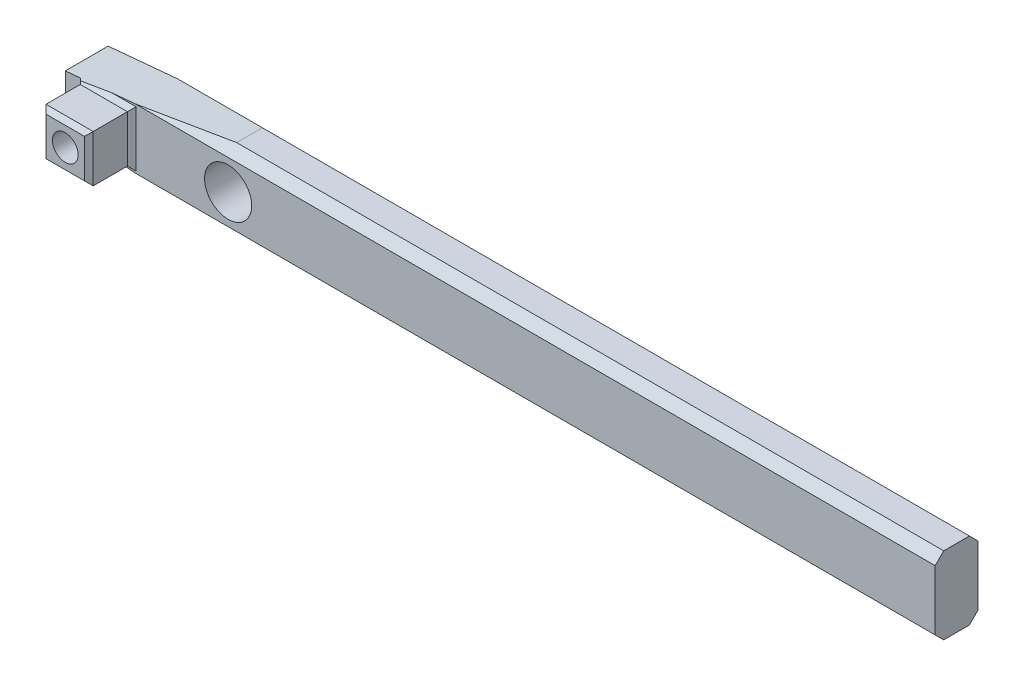
ISO-10303-21;
HEADER;
FILE_DESCRIPTION(('STEP AP214'),'2;1');
FILE_NAME('part.step','',(''),(''),'','','');
FILE_SCHEMA(('AUTOMOTIVE_DESIGN { 1 0 10303 214 1 1 1 1 }'));
ENDSEC;
DATA;
#1=APPLICATION_CONTEXT('core data for automotive mechanical design processes');
#2=APPLICATION_PROTOCOL_DEFINITION('international standard','automotive_design',2000,#1);
#3=PRODUCT_CONTEXT('',#1,'mechanical');
#4=PRODUCT('Part','Part','',(#3));
#5=PRODUCT_RELATED_PRODUCT_CATEGORY('part','',(#4));
#6=PRODUCT_DEFINITION_FORMATION('','',#4);
#7=PRODUCT_DEFINITION_CONTEXT('part definition',#1,'design');
#8=PRODUCT_DEFINITION('design','',#6,#7);
#9=PRODUCT_DEFINITION_SHAPE('','',#8);
#10=(LENGTH_UNIT() NAMED_UNIT(*) SI_UNIT(.MILLI.,.METRE.));
#11=(NAMED_UNIT(*) PLANE_ANGLE_UNIT() SI_UNIT($,.RADIAN.));
#12=(NAMED_UNIT(*) SI_UNIT($,.STERADIAN.) SOLID_ANGLE_UNIT());
#13=UNCERTAINTY_MEASURE_WITH_UNIT(LENGTH_MEASURE(1.E-05),#10,'distance_accuracy_value','');
#14=(GEOMETRIC_REPRESENTATION_CONTEXT(3) GLOBAL_UNCERTAINTY_ASSIGNED_CONTEXT((#13)) GLOBAL_UNIT_ASSIGNED_CONTEXT((#10,
#11,#12)) REPRESENTATION_CONTEXT('',''));
#15=CARTESIAN_POINT('',(0.,0.,0.));
#16=DIRECTION('',(0.,0.,1.));
#17=DIRECTION('',(1.,0.,0.));
#18=AXIS2_PLACEMENT_3D('',#15,#16,#17);
#19=CARTESIAN_POINT('',(0.,0.,5.));
#20=DIRECTION('',(0.,0.,-1.));
#21=DIRECTION('',(-1.,0.,0.));
#22=AXIS2_PLACEMENT_3D('',#19,#20,#21);
#23=PLANE('',#22);
#24=CARTESIAN_POINT('',(0.,0.,5.));
#25=DIRECTION('',(0.,0.,1.));
#26=DIRECTION('',(1.,0.,0.));
#27=AXIS2_PLACEMENT_3D('',#24,#25,#26);
#28=CIRCLE('',#27,2.75);
#29=CARTESIAN_POINT('',(2.75,0.,5.));
#30=VERTEX_POINT('',#29);
#31=EDGE_CURVE('E226',#30,#30,#28,.T.);
#32=ORIENTED_EDGE('',*,*,#31,.F.);
#33=EDGE_LOOP('',(#32));
#34=FACE_BOUND('',#33,.T.);
#35=DIRECTION('',(-0.995785108762236,-0.0917170494912561,0.));
#36=VECTOR('',#35,1.);
#37=CARTESIAN_POINT('',(-19.,2.75,5.));
#38=LINE('',#37,#36);
#39=CARTESIAN_POINT('',(-10.8571428571432,3.49999999999994,5.));
#40=VERTEX_POINT('',#39);
#41=CARTESIAN_POINT('',(-13.5714285714284,3.25000000000001,5.));
#42=VERTEX_POINT('',#41);
#43=EDGE_CURVE('E198',#40,#42,#38,.T.);
#44=ORIENTED_EDGE('',*,*,#43,.T.);
#45=DIRECTION('',(1.,0.,0.));
#46=VECTOR('',#45,1.);
#47=CARTESIAN_POINT('',(0.,3.25000000000001,5.));
#48=LINE('',#47,#46);
#49=CARTESIAN_POINT('',(-10.75,3.25000000000001,5.));
#50=VERTEX_POINT('',#49);
#51=EDGE_CURVE('E285',#42,#50,#48,.T.);
#52=ORIENTED_EDGE('',*,*,#51,.T.);
#53=DIRECTION('',(0.,-1.,0.));
#54=VECTOR('',#53,1.);
#55=CARTESIAN_POINT('',(-10.75,-2.75,5.));
#56=LINE('',#55,#54);
#57=CARTESIAN_POINT('',(-10.75,-3.25000000000002,5.));
#58=VERTEX_POINT('',#57);
#59=EDGE_CURVE('E283',#50,#58,#56,.T.);
#60=ORIENTED_EDGE('',*,*,#59,.T.);
#61=DIRECTION('',(-1.,0.,0.));
#62=VECTOR('',#61,1.);
#63=CARTESIAN_POINT('',(-16.75,-3.25000000000002,5.));
#64=LINE('',#63,#62);
#65=CARTESIAN_POINT('',(-13.5714285714284,-3.25000000000002,5.));
#66=VERTEX_POINT('',#65);
#67=EDGE_CURVE('E281',#58,#66,#64,.T.);
#68=ORIENTED_EDGE('',*,*,#67,.T.);
#69=DIRECTION('',(0.995785108762236,-0.0917170494912585,0.));
#70=VECTOR('',#69,1.);
#71=CARTESIAN_POINT('',(-19.,-2.75,5.));
#72=LINE('',#71,#70);
#73=CARTESIAN_POINT('',(-10.857142857143,-3.49999999999998,5.));
#74=VERTEX_POINT('',#73);
#75=EDGE_CURVE('E215',#66,#74,#72,.T.);
#76=ORIENTED_EDGE('',*,*,#75,.T.);
#77=DIRECTION('',(1.,0.,0.));
#78=VECTOR('',#77,1.);
#79=CARTESIAN_POINT('',(0.,-3.49999999999998,5.));
#80=LINE('',#79,#78);
#81=CARTESIAN_POINT('',(82.5,-3.49999999999998,5.));
#82=VERTEX_POINT('',#81);
#83=EDGE_CURVE('E246',#74,#82,#80,.T.);
#84=ORIENTED_EDGE('',*,*,#83,.T.);
#85=DIRECTION('',(0.,1.,0.));
#86=VECTOR('',#85,1.);
#87=CARTESIAN_POINT('',(82.5,4.5,5.));
#88=LINE('',#87,#86);
#89=CARTESIAN_POINT('',(82.5,3.5,5.));
#90=VERTEX_POINT('',#89);
#91=EDGE_CURVE('E199',#82,#90,#88,.T.);
#92=ORIENTED_EDGE('',*,*,#91,.T.);
#93=DIRECTION('',(-1.,0.,0.));
#94=VECTOR('',#93,1.);
#95=CARTESIAN_POINT('',(0.,3.49999999999995,5.));
#96=LINE('',#95,#94);
#97=EDGE_CURVE('E243',#90,#40,#96,.T.);
#98=ORIENTED_EDGE('',*,*,#97,.T.);
#99=EDGE_LOOP('',(#44,#52,#60,#68,#76,#84,#92,#98));
#100=FACE_BOUND('',#99,.T.);
#101=ADVANCED_FACE('F51',(#34,#100),#23,.F.);
#102=CARTESIAN_POINT('',(-19.,-2.75,5.));
#103=VERTEX_POINT('',#102);
#104=CARTESIAN_POINT('',(-17.25,-2.91118421052632,5.));
#105=VERTEX_POINT('',#104);
#106=EDGE_CURVE('E217',#103,#105,#72,.T.);
#107=ORIENTED_EDGE('',*,*,#106,.T.);
#108=DIRECTION('',(0.,1.,0.));
#109=VECTOR('',#108,1.);
#110=CARTESIAN_POINT('',(-17.25,0.,5.));
#111=LINE('',#110,#109);
#112=CARTESIAN_POINT('',(-17.25,2.91118421052631,5.));
#113=VERTEX_POINT('',#112);
#114=EDGE_CURVE('E197',#105,#113,#111,.T.);
#115=ORIENTED_EDGE('',*,*,#114,.T.);
#116=CARTESIAN_POINT('',(-19.,2.75,5.));
#117=VERTEX_POINT('',#116);
#118=EDGE_CURVE('E189',#113,#117,#38,.T.);
#119=ORIENTED_EDGE('',*,*,#118,.T.);
#120=DIRECTION('',(0.,-1.,0.));
#121=VECTOR('',#120,1.);
#122=CARTESIAN_POINT('',(-19.,2.75,5.));
#123=LINE('',#122,#121);
#124=EDGE_CURVE('E194',#117,#103,#123,.T.);
#125=ORIENTED_EDGE('',*,*,#124,.T.);
#126=EDGE_LOOP('',(#107,#115,#119,#125));
#127=FACE_BOUND('',#126,.T.);
#128=ADVANCED_FACE('F192',(#127),#23,.F.);
#129=CARTESIAN_POINT('',(0.,0.,0.));
#130=DIRECTION('',(0.,0.,-1.));
#131=DIRECTION('',(-1.,0.,0.));
#132=AXIS2_PLACEMENT_3D('',#129,#130,#131);
#133=PLANE('',#132);
#134=CARTESIAN_POINT('',(-14.,0.,0.));
#135=DIRECTION('',(0.,0.,1.));
#136=DIRECTION('',(1.,0.,0.));
#137=AXIS2_PLACEMENT_3D('',#134,#135,#136);
#138=CIRCLE('',#137,1.5);
#139=CARTESIAN_POINT('',(-12.5,0.,0.));
#140=VERTEX_POINT('',#139);
#141=EDGE_CURVE('E365',#140,#140,#138,.T.);
#142=ORIENTED_EDGE('',*,*,#141,.T.);
#143=EDGE_LOOP('',(#142));
#144=FACE_BOUND('',#143,.T.);
#145=DIRECTION('',(0.,1.,0.));
#146=VECTOR('',#145,1.);
#147=CARTESIAN_POINT('',(82.5,4.5,0.));
#148=LINE('',#147,#146);
#149=CARTESIAN_POINT('',(82.5,-3.5,0.));
#150=VERTEX_POINT('',#149);
#151=CARTESIAN_POINT('',(82.5,3.5,0.));
#152=VERTEX_POINT('',#151);
#153=EDGE_CURVE('E223',#150,#152,#148,.T.);
#154=ORIENTED_EDGE('',*,*,#153,.F.);
#155=DIRECTION('',(-1.,0.,0.));
#156=VECTOR('',#155,1.);
#157=CARTESIAN_POINT('',(0.,-3.5,0.));
#158=LINE('',#157,#156);
#159=CARTESIAN_POINT('',(-10.8571428571429,-3.5,0.));
#160=VERTEX_POINT('',#159);
#161=EDGE_CURVE('E269',#150,#160,#158,.T.);
#162=ORIENTED_EDGE('',*,*,#161,.T.);
#163=DIRECTION('',(0.995785108762236,-0.0917170494912585,0.));
#164=VECTOR('',#163,1.);
#165=CARTESIAN_POINT('',(-19.,-2.75,0.));
#166=LINE('',#165,#164);
#167=CARTESIAN_POINT('',(-19.,-2.75,0.));
#168=VERTEX_POINT('',#167);
#169=EDGE_CURVE('E230',#168,#160,#166,.T.);
#170=ORIENTED_EDGE('',*,*,#169,.F.);
#171=DIRECTION('',(0.,-1.,0.));
#172=VECTOR('',#171,1.);
#173=CARTESIAN_POINT('',(-19.,2.75,0.));
#174=LINE('',#173,#172);
#175=CARTESIAN_POINT('',(-19.,2.75,0.));
#176=VERTEX_POINT('',#175);
#177=EDGE_CURVE('E228',#176,#168,#174,.T.);
#178=ORIENTED_EDGE('',*,*,#177,.F.);
#179=DIRECTION('',(-0.995785108762236,-0.0917170494912561,0.));
#180=VECTOR('',#179,1.);
#181=CARTESIAN_POINT('',(-19.,2.75,0.));
#182=LINE('',#181,#180);
#183=CARTESIAN_POINT('',(-10.8571428571432,3.49999999999994,0.));
#184=VERTEX_POINT('',#183);
#185=EDGE_CURVE('E206',#184,#176,#182,.T.);
#186=ORIENTED_EDGE('',*,*,#185,.F.);
#187=DIRECTION('',(1.,0.,0.));
#188=VECTOR('',#187,1.);
#189=CARTESIAN_POINT('',(82.5,3.5,0.));
#190=LINE('',#189,#188);
#191=EDGE_CURVE('E267',#184,#152,#190,.T.);
#192=ORIENTED_EDGE('',*,*,#191,.T.);
#193=EDGE_LOOP('',(#154,#162,#170,#178,#186,#192));
#194=FACE_BOUND('',#193,.T.);
#195=CARTESIAN_POINT('',(0.,0.,0.));
#196=DIRECTION('',(0.,0.,1.));
#197=DIRECTION('',(1.,0.,0.));
#198=AXIS2_PLACEMENT_3D('',#195,#196,#197);
#199=CIRCLE('',#198,2.75);
#200=CARTESIAN_POINT('',(2.75,0.,0.));
#201=VERTEX_POINT('',#200);
#202=EDGE_CURVE('E373',#201,#201,#199,.T.);
#203=ORIENTED_EDGE('',*,*,#202,.T.);
#204=EDGE_LOOP('',(#203));
#205=FACE_BOUND('',#204,.T.);
#206=ADVANCED_FACE('F399',(#144,#194,#205),#133,.T.);
#207=CARTESIAN_POINT('',(0.,-4.5,5.));
#208=DIRECTION('',(0.,1.,0.));
#209=DIRECTION('',(0.,0.,1.));
#210=AXIS2_PLACEMENT_3D('',#207,#208,#209);
#211=PLANE('',#210);
#212=DIRECTION('',(0.,0.,-1.));
#213=VECTOR('',#212,1.);
#214=CARTESIAN_POINT('',(82.5,-4.5,5.));
#215=LINE('',#214,#213);
#216=CARTESIAN_POINT('',(82.5,-4.5,3.99999999999999));
#217=VERTEX_POINT('',#216);
#218=CARTESIAN_POINT('',(82.5,-4.5,1.));
#219=VERTEX_POINT('',#218);
#220=EDGE_CURVE('E240',#217,#219,#215,.T.);
#221=ORIENTED_EDGE('',*,*,#220,.F.);
#222=DIRECTION('',(-1.,0.,0.));
#223=VECTOR('',#222,1.);
#224=CARTESIAN_POINT('',(0.,-4.5,3.99999999999999));
#225=LINE('',#224,#223);
#226=CARTESIAN_POINT('',(0.,-4.5,3.99999999999999));
#227=VERTEX_POINT('',#226);
#228=EDGE_CURVE('E260',#217,#227,#225,.T.);
#229=ORIENTED_EDGE('',*,*,#228,.T.);
#230=DIRECTION('',(0.,0.,-1.));
#231=VECTOR('',#230,1.);
#232=CARTESIAN_POINT('',(0.,-4.5,5.));
#233=LINE('',#232,#231);
#234=CARTESIAN_POINT('',(0.,-4.5,1.));
#235=VERTEX_POINT('',#234);
#236=EDGE_CURVE('E222',#227,#235,#233,.T.);
#237=ORIENTED_EDGE('',*,*,#236,.T.);
#238=DIRECTION('',(1.,0.,0.));
#239=VECTOR('',#238,1.);
#240=CARTESIAN_POINT('',(82.5,-4.5,1.));
#241=LINE('',#240,#239);
#242=EDGE_CURVE('E257',#235,#219,#241,.T.);
#243=ORIENTED_EDGE('',*,*,#242,.T.);
#244=EDGE_LOOP('',(#221,#229,#237,#243));
#245=FACE_BOUND('',#244,.T.);
#246=ADVANCED_FACE('F457',(#245),#211,.F.);
#247=CARTESIAN_POINT('',(82.5,4.5,5.));
#248=DIRECTION('',(-1.,0.,0.));
#249=DIRECTION('',(0.,0.,1.));
#250=AXIS2_PLACEMENT_3D('',#247,#248,#249);
#251=PLANE('',#250);
#252=ORIENTED_EDGE('',*,*,#91,.F.);
#253=DIRECTION('',(0.,0.707106781186548,0.707106781186548));
#254=VECTOR('',#253,1.);
#255=CARTESIAN_POINT('',(82.5,-3.49999999999998,5.));
#256=LINE('',#255,#254);
#257=EDGE_CURVE('E255',#82,#217,#256,.F.);
#258=ORIENTED_EDGE('',*,*,#257,.T.);
#259=ORIENTED_EDGE('',*,*,#220,.T.);
#260=DIRECTION('',(0.,0.707106781186548,-0.707106781186548));
#261=VECTOR('',#260,1.);
#262=CARTESIAN_POINT('',(82.5,-4.5,1.));
#263=LINE('',#262,#261);
#264=EDGE_CURVE('E253',#219,#150,#263,.T.);
#265=ORIENTED_EDGE('',*,*,#264,.T.);
#266=ORIENTED_EDGE('',*,*,#153,.T.);
#267=DIRECTION('',(0.,0.707106781186548,0.707106781186548));
#268=VECTOR('',#267,1.);
#269=CARTESIAN_POINT('',(82.5,4.49999999999997,0.999999999999976));
#270=LINE('',#269,#268);
#271=CARTESIAN_POINT('',(82.5,4.5,1.));
#272=VERTEX_POINT('',#271);
#273=EDGE_CURVE('E251',#152,#272,#270,.T.);
#274=ORIENTED_EDGE('',*,*,#273,.T.);
#275=DIRECTION('',(0.,0.,-1.));
#276=VECTOR('',#275,1.);
#277=CARTESIAN_POINT('',(82.5,4.5,5.));
#278=LINE('',#277,#276);
#279=CARTESIAN_POINT('',(82.5,4.5,4.));
#280=VERTEX_POINT('',#279);
#281=EDGE_CURVE('E237',#280,#272,#278,.T.);
#282=ORIENTED_EDGE('',*,*,#281,.F.);
#283=DIRECTION('',(0.,0.707106781186548,-0.707106781186548));
#284=VECTOR('',#283,1.);
#285=CARTESIAN_POINT('',(82.5,3.49999999999997,5.00000000000002));
#286=LINE('',#285,#284);
#287=EDGE_CURVE('E249',#280,#90,#286,.F.);
#288=ORIENTED_EDGE('',*,*,#287,.T.);
#289=EDGE_LOOP('',(#252,#258,#259,#265,#266,#274,#282,#288));
#290=FACE_BOUND('',#289,.T.);
#291=ADVANCED_FACE('F467',(#290),#251,.F.);
#292=CARTESIAN_POINT('',(0.,4.49999999999995,5.));
#293=DIRECTION('',(0.,-1.,0.));
#294=DIRECTION('',(1.,0.,0.));
#295=AXIS2_PLACEMENT_3D('',#292,#293,#294);
#296=PLANE('',#295);
#297=ORIENTED_EDGE('',*,*,#281,.T.);
#298=DIRECTION('',(-1.,0.,0.));
#299=VECTOR('',#298,1.);
#300=CARTESIAN_POINT('',(0.,4.49999999999995,1.));
#301=LINE('',#300,#299);
#302=CARTESIAN_POINT('',(0.,4.49999999999995,1.));
#303=VERTEX_POINT('',#302);
#304=EDGE_CURVE('E273',#272,#303,#301,.T.);
#305=ORIENTED_EDGE('',*,*,#304,.T.);
#306=DIRECTION('',(0.,0.,-1.));
#307=VECTOR('',#306,1.);
#308=CARTESIAN_POINT('',(0.,4.49999999999995,5.));
#309=LINE('',#308,#307);
#310=CARTESIAN_POINT('',(0.,4.49999999999995,4.));
#311=VERTEX_POINT('',#310);
#312=EDGE_CURVE('E209',#311,#303,#309,.T.);
#313=ORIENTED_EDGE('',*,*,#312,.F.);
#314=DIRECTION('',(1.,0.,0.));
#315=VECTOR('',#314,1.);
#316=CARTESIAN_POINT('',(0.,4.49999999999995,4.));
#317=LINE('',#316,#315);
#318=EDGE_CURVE('E271',#311,#280,#317,.T.);
#319=ORIENTED_EDGE('',*,*,#318,.T.);
#320=EDGE_LOOP('',(#297,#305,#313,#319));
#321=FACE_BOUND('',#320,.T.);
#322=ADVANCED_FACE('F390',(#321),#296,.F.);
#323=CARTESIAN_POINT('',(-19.,2.75,5.));
#324=DIRECTION('',(0.0917170494912561,-0.995785108762236,0.));
#325=DIRECTION('',(0.995785108762236,0.0917170494912561,0.));
#326=AXIS2_PLACEMENT_3D('',#323,#324,#325);
#327=PLANE('',#326);
#328=ORIENTED_EDGE('',*,*,#312,.T.);
#329=DIRECTION('',(-0.991623068085352,-0.0913337036394378,-0.0913337036394372));
#330=VECTOR('',#329,1.);
#331=CARTESIAN_POINT('',(0.,4.49999999999995,1.));
#332=LINE('',#331,#330);
#333=EDGE_CURVE('E278',#303,#184,#332,.T.);
#334=ORIENTED_EDGE('',*,*,#333,.T.);
#335=ORIENTED_EDGE('',*,*,#185,.T.);
#336=DIRECTION('',(0.,0.,-1.));
#337=VECTOR('',#336,1.);
#338=CARTESIAN_POINT('',(-19.,2.75,5.));
#339=LINE('',#338,#337);
#340=EDGE_CURVE('E202',#117,#176,#339,.T.);
#341=ORIENTED_EDGE('',*,*,#340,.F.);
#342=ORIENTED_EDGE('',*,*,#118,.F.);
#343=DIRECTION('',(0.705611871423456,0.0649905671047903,0.705611871423437));
#344=VECTOR('',#343,1.);
#345=CARTESIAN_POINT('',(-18.1286958020861,2.83025170243944,4.12130419791398));
#346=LINE('',#345,#344);
#347=CARTESIAN_POINT('',(-16.9397590361446,2.93975903614457,5.31024096385543));
#348=VERTEX_POINT('',#347);
#349=EDGE_CURVE('E61',#113,#348,#346,.T.);
#350=ORIENTED_EDGE('',*,*,#349,.T.);
#351=DIRECTION('',(0.991623068085352,0.0913337036394378,-0.0913337036394353));
#352=VECTOR('',#351,1.);
#353=CARTESIAN_POINT('',(-18.9547156962887,2.75417092271025,5.49582907728975));
#354=LINE('',#353,#352);
#355=EDGE_CURVE('E315',#348,#42,#354,.T.);
#356=ORIENTED_EDGE('',*,*,#355,.T.);
#357=ORIENTED_EDGE('',*,*,#43,.F.);
#358=DIRECTION('',(-0.991623068085352,-0.0913337036394378,0.0913337036394372));
#359=VECTOR('',#358,1.);
#360=CARTESIAN_POINT('',(-0.181137214845077,4.48331630915896,4.01668369084099));
#361=LINE('',#360,#359);
#362=EDGE_CURVE('E276',#40,#311,#361,.F.);
#363=ORIENTED_EDGE('',*,*,#362,.T.);
#364=EDGE_LOOP('',(#328,#334,#335,#341,#342,#350,#356,#357,#363));
#365=FACE_BOUND('',#364,.T.);
#366=ADVANCED_FACE('F204',(#365),#327,.F.);
#367=CARTESIAN_POINT('',(-19.,2.75,5.));
#368=DIRECTION('',(1.,0.,0.));
#369=DIRECTION('',(0.,0.,-1.));
#370=AXIS2_PLACEMENT_3D('',#367,#368,#369);
#371=PLANE('',#370);
#372=ORIENTED_EDGE('',*,*,#177,.T.);
#373=DIRECTION('',(0.,0.,-1.));
#374=VECTOR('',#373,1.);
#375=CARTESIAN_POINT('',(-19.,-2.75,5.));
#376=LINE('',#375,#374);
#377=EDGE_CURVE('E210',#103,#168,#376,.T.);
#378=ORIENTED_EDGE('',*,*,#377,.F.);
#379=ORIENTED_EDGE('',*,*,#124,.F.);
#380=ORIENTED_EDGE('',*,*,#340,.T.);
#381=EDGE_LOOP('',(#372,#378,#379,#380));
#382=FACE_BOUND('',#381,.T.);
#383=ADVANCED_FACE('F212',(#382),#371,.F.);
#384=CARTESIAN_POINT('',(-19.,-2.75,5.));
#385=DIRECTION('',(0.0917170494912585,0.995785108762236,0.));
#386=DIRECTION('',(-0.995785108762236,0.0917170494912585,0.));
#387=AXIS2_PLACEMENT_3D('',#384,#385,#386);
#388=PLANE('',#387);
#389=ORIENTED_EDGE('',*,*,#236,.F.);
#390=DIRECTION('',(0.991623068085352,-0.0913337036394402,-0.0913337036394402));
#391=VECTOR('',#390,1.);
#392=CARTESIAN_POINT('',(-0.181137214845083,-4.48331630915901,4.01668369084098));
#393=LINE('',#392,#391);
#394=EDGE_CURVE('E264',#227,#74,#393,.F.);
#395=ORIENTED_EDGE('',*,*,#394,.T.);
#396=ORIENTED_EDGE('',*,*,#75,.F.);
#397=DIRECTION('',(0.991623068085352,-0.0913337036394402,-0.0913337036394376));
#398=VECTOR('',#397,1.);
#399=CARTESIAN_POINT('',(-18.9547156962887,-2.75417092271025,5.49582907728975));
#400=LINE('',#399,#398);
#401=CARTESIAN_POINT('',(-16.9397590361446,-2.93975903614458,5.31024096385543));
#402=VERTEX_POINT('',#401);
#403=EDGE_CURVE('E68',#66,#402,#400,.F.);
#404=ORIENTED_EDGE('',*,*,#403,.T.);
#405=DIRECTION('',(-0.705611871423457,0.064990567104792,-0.705611871423437));
#406=VECTOR('',#405,1.);
#407=CARTESIAN_POINT('',(-18.1286958020861,-2.83025170243944,4.12130419791398));
#408=LINE('',#407,#406);
#409=EDGE_CURVE('E12',#402,#105,#408,.T.);
#410=ORIENTED_EDGE('',*,*,#409,.T.);
#411=ORIENTED_EDGE('',*,*,#106,.F.);
#412=ORIENTED_EDGE('',*,*,#377,.T.);
#413=ORIENTED_EDGE('',*,*,#169,.T.);
#414=DIRECTION('',(0.991623068085352,-0.0913337036394402,0.0913337036394402));
#415=VECTOR('',#414,1.);
#416=CARTESIAN_POINT('',(0.,-4.5,1.));
#417=LINE('',#416,#415);
#418=EDGE_CURVE('E262',#160,#235,#417,.T.);
#419=ORIENTED_EDGE('',*,*,#418,.T.);
#420=EDGE_LOOP('',(#389,#395,#396,#404,#410,#411,#412,#413,#419));
#421=FACE_BOUND('',#420,.T.);
#422=ADVANCED_FACE('F403',(#421),#388,.F.);
#423=CARTESIAN_POINT('',(0.,0.,5.));
#424=DIRECTION('',(0.,0.,-1.));
#425=DIRECTION('',(-1.,0.,0.));
#426=AXIS2_PLACEMENT_3D('',#423,#424,#425);
#427=CYLINDRICAL_SURFACE('',#426,2.75);
#428=ORIENTED_EDGE('',*,*,#31,.T.);
#429=EDGE_LOOP('',(#428));
#430=FACE_BOUND('',#429,.T.);
#431=ORIENTED_EDGE('',*,*,#202,.F.);
#432=EDGE_LOOP('',(#431));
#433=FACE_BOUND('',#432,.T.);
#434=ADVANCED_FACE('F454',(#430,#433),#427,.F.);
#435=CARTESIAN_POINT('',(0.,-3.49999999999998,5.));
#436=DIRECTION('',(0.,0.707106781186547,-0.707106781186547));
#437=DIRECTION('',(1.,0.,0.));
#438=AXIS2_PLACEMENT_3D('',#435,#436,#437);
#439=PLANE('',#438);
#440=ORIENTED_EDGE('',*,*,#394,.F.);
#441=ORIENTED_EDGE('',*,*,#228,.F.);
#442=ORIENTED_EDGE('',*,*,#257,.F.);
#443=ORIENTED_EDGE('',*,*,#83,.F.);
#444=EDGE_LOOP('',(#440,#441,#442,#443));
#445=FACE_BOUND('',#444,.T.);
#446=ADVANCED_FACE('F474',(#445),#439,.F.);
#447=CARTESIAN_POINT('',(0.,-4.5,1.));
#448=DIRECTION('',(0.,-0.707106781186547,-0.707106781186547));
#449=DIRECTION('',(-1.,0.,0.));
#450=AXIS2_PLACEMENT_3D('',#447,#448,#449);
#451=PLANE('',#450);
#452=ORIENTED_EDGE('',*,*,#418,.F.);
#453=ORIENTED_EDGE('',*,*,#161,.F.);
#454=ORIENTED_EDGE('',*,*,#264,.F.);
#455=ORIENTED_EDGE('',*,*,#242,.F.);
#456=EDGE_LOOP('',(#452,#453,#454,#455));
#457=FACE_BOUND('',#456,.T.);
#458=ADVANCED_FACE('F480',(#457),#451,.T.);
#459=CARTESIAN_POINT('',(0.,4.49999999999995,1.));
#460=DIRECTION('',(0.,0.707106781186547,-0.707106781186547));
#461=DIRECTION('',(1.,0.,0.));
#462=AXIS2_PLACEMENT_3D('',#459,#460,#461);
#463=PLANE('',#462);
#464=ORIENTED_EDGE('',*,*,#273,.F.);
#465=ORIENTED_EDGE('',*,*,#191,.F.);
#466=ORIENTED_EDGE('',*,*,#333,.F.);
#467=ORIENTED_EDGE('',*,*,#304,.F.);
#468=EDGE_LOOP('',(#464,#465,#466,#467));
#469=FACE_BOUND('',#468,.T.);
#470=ADVANCED_FACE('F395',(#469),#463,.T.);
#471=CARTESIAN_POINT('',(0.,3.49999999999995,5.));
#472=DIRECTION('',(0.,-0.707106781186547,-0.707106781186547));
#473=DIRECTION('',(-1.,0.,0.));
#474=AXIS2_PLACEMENT_3D('',#471,#472,#473);
#475=PLANE('',#474);
#476=ORIENTED_EDGE('',*,*,#287,.F.);
#477=ORIENTED_EDGE('',*,*,#318,.F.);
#478=ORIENTED_EDGE('',*,*,#362,.F.);
#479=ORIENTED_EDGE('',*,*,#97,.F.);
#480=EDGE_LOOP('',(#476,#477,#478,#479));
#481=FACE_BOUND('',#480,.T.);
#482=ADVANCED_FACE('F386',(#481),#475,.F.);
#483=CARTESIAN_POINT('',(-14.,0.,0.));
#484=DIRECTION('',(0.,0.,1.));
#485=DIRECTION('',(1.,0.,0.));
#486=AXIS2_PLACEMENT_3D('',#483,#484,#485);
#487=CYLINDRICAL_SURFACE('',#486,1.5);
#488=ORIENTED_EDGE('',*,*,#141,.F.);
#489=EDGE_LOOP('',(#488));
#490=FACE_BOUND('',#489,.T.);
#491=CARTESIAN_POINT('',(-14.,0.,10.));
#492=DIRECTION('',(0.,0.,1.));
#493=DIRECTION('',(1.,0.,0.));
#494=AXIS2_PLACEMENT_3D('',#491,#492,#493);
#495=CIRCLE('',#494,1.5);
#496=CARTESIAN_POINT('',(-12.5,0.,10.));
#497=VERTEX_POINT('',#496);
#498=EDGE_CURVE('E329',#497,#497,#495,.F.);
#499=ORIENTED_EDGE('',*,*,#498,.F.);
#500=EDGE_LOOP('',(#499));
#501=FACE_BOUND('',#500,.T.);
#502=ADVANCED_FACE('F433',(#490,#501),#487,.F.);
#503=CARTESIAN_POINT('',(0.,-2.75,10.));
#504=DIRECTION('',(0.,1.,0.));
#505=DIRECTION('',(0.,0.,1.));
#506=AXIS2_PLACEMENT_3D('',#503,#504,#505);
#507=PLANE('',#506);
#508=DIRECTION('',(0.,0.,-1.));
#509=VECTOR('',#508,1.);
#510=CARTESIAN_POINT('',(-16.75,-2.75,10.));
#511=LINE('',#510,#509);
#512=CARTESIAN_POINT('',(-16.75,-2.75,9.5));
#513=VERTEX_POINT('',#512);
#514=CARTESIAN_POINT('',(-16.75,-2.75,5.5));
#515=VERTEX_POINT('',#514);
#516=EDGE_CURVE('E367',#513,#515,#511,.T.);
#517=ORIENTED_EDGE('',*,*,#516,.T.);
#518=DIRECTION('',(1.,0.,0.));
#519=VECTOR('',#518,1.);
#520=CARTESIAN_POINT('',(-11.25,-2.75,5.5));
#521=LINE('',#520,#519);
#522=CARTESIAN_POINT('',(-11.25,-2.75,5.5));
#523=VERTEX_POINT('',#522);
#524=EDGE_CURVE('E300',#515,#523,#521,.T.);
#525=ORIENTED_EDGE('',*,*,#524,.T.);
#526=DIRECTION('',(0.,0.,-1.));
#527=VECTOR('',#526,1.);
#528=CARTESIAN_POINT('',(-11.25,-2.75,10.));
#529=LINE('',#528,#527);
#530=CARTESIAN_POINT('',(-11.25,-2.75,9.5));
#531=VERTEX_POINT('',#530);
#532=EDGE_CURVE('E363',#531,#523,#529,.T.);
#533=ORIENTED_EDGE('',*,*,#532,.F.);
#534=DIRECTION('',(-1.,0.,0.));
#535=VECTOR('',#534,1.);
#536=CARTESIAN_POINT('',(-16.75,-2.75,9.5));
#537=LINE('',#536,#535);
#538=EDGE_CURVE('E297',#531,#513,#537,.T.);
#539=ORIENTED_EDGE('',*,*,#538,.T.);
#540=EDGE_LOOP('',(#517,#525,#533,#539));
#541=FACE_BOUND('',#540,.T.);
#542=ADVANCED_FACE('F435',(#541),#507,.F.);
#543=CARTESIAN_POINT('',(-11.25,0.,10.));
#544=DIRECTION('',(-1.,0.,0.));
#545=DIRECTION('',(0.,0.,1.));
#546=AXIS2_PLACEMENT_3D('',#543,#544,#545);
#547=PLANE('',#546);
#548=ORIENTED_EDGE('',*,*,#532,.T.);
#549=DIRECTION('',(0.,1.,0.));
#550=VECTOR('',#549,1.);
#551=CARTESIAN_POINT('',(-11.25,2.75,5.5));
#552=LINE('',#551,#550);
#553=CARTESIAN_POINT('',(-11.25,2.75,5.5));
#554=VERTEX_POINT('',#553);
#555=EDGE_CURVE('E295',#523,#554,#552,.T.);
#556=ORIENTED_EDGE('',*,*,#555,.T.);
#557=DIRECTION('',(0.,0.,-1.));
#558=VECTOR('',#557,1.);
#559=CARTESIAN_POINT('',(-11.25,2.75,10.));
#560=LINE('',#559,#558);
#561=CARTESIAN_POINT('',(-11.25,2.75,9.5));
#562=VERTEX_POINT('',#561);
#563=EDGE_CURVE('E354',#562,#554,#560,.T.);
#564=ORIENTED_EDGE('',*,*,#563,.F.);
#565=DIRECTION('',(0.,-1.,0.));
#566=VECTOR('',#565,1.);
#567=CARTESIAN_POINT('',(-11.25,-2.75,9.5));
#568=LINE('',#567,#566);
#569=EDGE_CURVE('E293',#562,#531,#568,.T.);
#570=ORIENTED_EDGE('',*,*,#569,.T.);
#571=EDGE_LOOP('',(#548,#556,#564,#570));
#572=FACE_BOUND('',#571,.T.);
#573=ADVANCED_FACE('F360',(#572),#547,.F.);
#574=CARTESIAN_POINT('',(0.,2.75,10.));
#575=DIRECTION('',(0.,1.,0.));
#576=DIRECTION('',(0.,0.,1.));
#577=AXIS2_PLACEMENT_3D('',#574,#575,#576);
#578=PLANE('',#577);
#579=ORIENTED_EDGE('',*,*,#563,.T.);
#580=DIRECTION('',(-1.,0.,0.));
#581=VECTOR('',#580,1.);
#582=CARTESIAN_POINT('',(0.,2.75,5.5));
#583=LINE('',#582,#581);
#584=CARTESIAN_POINT('',(-16.75,2.75,5.5));
#585=VERTEX_POINT('',#584);
#586=EDGE_CURVE('E290',#554,#585,#583,.T.);
#587=ORIENTED_EDGE('',*,*,#586,.T.);
#588=DIRECTION('',(0.,0.,-1.));
#589=VECTOR('',#588,1.);
#590=CARTESIAN_POINT('',(-16.75,2.75,10.));
#591=LINE('',#590,#589);
#592=CARTESIAN_POINT('',(-16.75,2.75,9.5));
#593=VERTEX_POINT('',#592);
#594=EDGE_CURVE('E357',#593,#585,#591,.T.);
#595=ORIENTED_EDGE('',*,*,#594,.F.);
#596=DIRECTION('',(1.,0.,0.));
#597=VECTOR('',#596,1.);
#598=CARTESIAN_POINT('',(0.,2.75,9.5));
#599=LINE('',#598,#597);
#600=EDGE_CURVE('E288',#593,#562,#599,.T.);
#601=ORIENTED_EDGE('',*,*,#600,.T.);
#602=EDGE_LOOP('',(#579,#587,#595,#601));
#603=FACE_BOUND('',#602,.T.);
#604=ADVANCED_FACE('F353',(#603),#578,.T.);
#605=CARTESIAN_POINT('',(-16.75,0.,10.));
#606=DIRECTION('',(-1.,0.,0.));
#607=DIRECTION('',(0.,0.,1.));
#608=AXIS2_PLACEMENT_3D('',#605,#606,#607);
#609=PLANE('',#608);
#610=ORIENTED_EDGE('',*,*,#594,.T.);
#611=DIRECTION('',(0.,-1.,0.));
#612=VECTOR('',#611,1.);
#613=CARTESIAN_POINT('',(-16.75,0.,5.5));
#614=LINE('',#613,#612);
#615=EDGE_CURVE('E304',#585,#515,#614,.T.);
#616=ORIENTED_EDGE('',*,*,#615,.T.);
#617=ORIENTED_EDGE('',*,*,#516,.F.);
#618=DIRECTION('',(0.,1.,0.));
#619=VECTOR('',#618,1.);
#620=CARTESIAN_POINT('',(-16.75,0.,9.5));
#621=LINE('',#620,#619);
#622=EDGE_CURVE('E302',#513,#593,#621,.T.);
#623=ORIENTED_EDGE('',*,*,#622,.T.);
#624=EDGE_LOOP('',(#610,#616,#617,#623));
#625=FACE_BOUND('',#624,.T.);
#626=ADVANCED_FACE('F423',(#625),#609,.T.);
#627=CARTESIAN_POINT('',(0.,0.,10.));
#628=DIRECTION('',(0.,0.,1.));
#629=DIRECTION('',(1.,0.,0.));
#630=AXIS2_PLACEMENT_3D('',#627,#628,#629);
#631=PLANE('',#630);
#632=DIRECTION('',(0.,-1.,0.));
#633=VECTOR('',#632,1.);
#634=CARTESIAN_POINT('',(-16.25,0.,10.));
#635=LINE('',#634,#633);
#636=CARTESIAN_POINT('',(-16.25,2.25,10.));
#637=VERTEX_POINT('',#636);
#638=CARTESIAN_POINT('',(-16.25,-2.25,10.));
#639=VERTEX_POINT('',#638);
#640=EDGE_CURVE('E310',#637,#639,#635,.T.);
#641=ORIENTED_EDGE('',*,*,#640,.T.);
#642=DIRECTION('',(1.,0.,0.));
#643=VECTOR('',#642,1.);
#644=CARTESIAN_POINT('',(-11.25,-2.25,10.));
#645=LINE('',#644,#643);
#646=CARTESIAN_POINT('',(-11.75,-2.25,10.));
#647=VERTEX_POINT('',#646);
#648=EDGE_CURVE('E312',#639,#647,#645,.T.);
#649=ORIENTED_EDGE('',*,*,#648,.T.);
#650=DIRECTION('',(0.,1.,0.));
#651=VECTOR('',#650,1.);
#652=CARTESIAN_POINT('',(-11.75,2.75,10.));
#653=LINE('',#652,#651);
#654=CARTESIAN_POINT('',(-11.75,2.25,10.));
#655=VERTEX_POINT('',#654);
#656=EDGE_CURVE('E308',#647,#655,#653,.T.);
#657=ORIENTED_EDGE('',*,*,#656,.T.);
#658=DIRECTION('',(-1.,0.,0.));
#659=VECTOR('',#658,1.);
#660=CARTESIAN_POINT('',(0.,2.25,10.));
#661=LINE('',#660,#659);
#662=EDGE_CURVE('E306',#655,#637,#661,.T.);
#663=ORIENTED_EDGE('',*,*,#662,.T.);
#664=EDGE_LOOP('',(#641,#649,#657,#663));
#665=FACE_BOUND('',#664,.T.);
#666=ORIENTED_EDGE('',*,*,#498,.T.);
#667=EDGE_LOOP('',(#666));
#668=FACE_BOUND('',#667,.T.);
#669=ADVANCED_FACE('F431',(#665,#668),#631,.T.);
#670=CARTESIAN_POINT('',(0.,-2.75,5.5));
#671=DIRECTION('',(0.,-0.707106781186538,0.707106781186557));
#672=DIRECTION('',(-1.,0.,0.));
#673=AXIS2_PLACEMENT_3D('',#670,#671,#672);
#674=PLANE('',#673);
#675=DIRECTION('',(-0.577350269189631,0.577350269189631,0.577350269189615));
#676=VECTOR('',#675,1.);
#677=CARTESIAN_POINT('',(-7.49999999999993,-6.50000000000007,1.75000000000004));
#678=LINE('',#677,#676);
#679=EDGE_CURVE('E323',#523,#58,#678,.F.);
#680=ORIENTED_EDGE('',*,*,#679,.F.);
#681=ORIENTED_EDGE('',*,*,#524,.F.);
#682=DIRECTION('',(0.577350269189631,0.577350269189631,0.577350269189615));
#683=VECTOR('',#682,1.);
#684=CARTESIAN_POINT('',(-11.1666666666666,2.83333333333343,11.0833333333333));
#685=LINE('',#684,#683);
#686=EDGE_CURVE('E326',#402,#515,#685,.T.);
#687=ORIENTED_EDGE('',*,*,#686,.F.);
#688=ORIENTED_EDGE('',*,*,#403,.F.);
#689=ORIENTED_EDGE('',*,*,#67,.F.);
#690=EDGE_LOOP('',(#680,#681,#687,#688,#689));
#691=FACE_BOUND('',#690,.T.);
#692=ADVANCED_FACE('F419',(#691),#674,.T.);
#693=CARTESIAN_POINT('',(-17.25,0.,5.));
#694=DIRECTION('',(0.707106781186538,0.,-0.707106781186557));
#695=DIRECTION('',(0.,1.,0.));
#696=AXIS2_PLACEMENT_3D('',#693,#694,#695);
#697=PLANE('',#696);
#698=ORIENTED_EDGE('',*,*,#686,.T.);
#699=ORIENTED_EDGE('',*,*,#615,.F.);
#700=DIRECTION('',(0.577350269189631,-0.577350269189631,0.577350269189615));
#701=VECTOR('',#700,1.);
#702=CARTESIAN_POINT('',(-11.4999999999999,-2.5000000000001,10.75));
#703=LINE('',#702,#701);
#704=EDGE_CURVE('E321',#348,#585,#703,.T.);
#705=ORIENTED_EDGE('',*,*,#704,.F.);
#706=ORIENTED_EDGE('',*,*,#349,.F.);
#707=ORIENTED_EDGE('',*,*,#114,.F.);
#708=ORIENTED_EDGE('',*,*,#409,.F.);
#709=EDGE_LOOP('',(#698,#699,#705,#706,#707,#708));
#710=FACE_BOUND('',#709,.T.);
#711=ADVANCED_FACE('F407',(#710),#697,.F.);
#712=CARTESIAN_POINT('',(-11.25,0.,5.5));
#713=DIRECTION('',(0.707106781186538,0.,0.707106781186557));
#714=DIRECTION('',(0.,-1.,0.));
#715=AXIS2_PLACEMENT_3D('',#712,#713,#714);
#716=PLANE('',#715);
#717=ORIENTED_EDGE('',*,*,#679,.T.);
#718=ORIENTED_EDGE('',*,*,#59,.F.);
#719=DIRECTION('',(0.577350269189631,0.577350269189631,-0.577350269189615));
#720=VECTOR('',#719,1.);
#721=CARTESIAN_POINT('',(-12.1666666666667,1.83333333333332,6.41666666666666));
#722=LINE('',#721,#720);
#723=EDGE_CURVE('E319',#554,#50,#722,.T.);
#724=ORIENTED_EDGE('',*,*,#723,.F.);
#725=ORIENTED_EDGE('',*,*,#555,.F.);
#726=EDGE_LOOP('',(#717,#718,#724,#725));
#727=FACE_BOUND('',#726,.T.);
#728=ADVANCED_FACE('F421',(#727),#716,.T.);
#729=CARTESIAN_POINT('',(0.,3.25000000000001,5.));
#730=DIRECTION('',(0.,-0.707106781186538,-0.707106781186557));
#731=DIRECTION('',(1.,0.,0.));
#732=AXIS2_PLACEMENT_3D('',#729,#730,#731);
#733=PLANE('',#732);
#734=ORIENTED_EDGE('',*,*,#704,.T.);
#735=ORIENTED_EDGE('',*,*,#586,.F.);
#736=ORIENTED_EDGE('',*,*,#723,.T.);
#737=ORIENTED_EDGE('',*,*,#51,.F.);
#738=ORIENTED_EDGE('',*,*,#355,.F.);
#739=EDGE_LOOP('',(#734,#735,#736,#737,#738));
#740=FACE_BOUND('',#739,.T.);
#741=ADVANCED_FACE('F412',(#740),#733,.F.);
#742=CARTESIAN_POINT('',(0.,2.75,9.5));
#743=DIRECTION('',(0.,-0.707106781186547,-0.707106781186547));
#744=DIRECTION('',(1.,0.,0.));
#745=AXIS2_PLACEMENT_3D('',#742,#743,#744);
#746=PLANE('',#745);
#747=DIRECTION('',(-0.577350269189626,-0.577350269189626,0.577350269189626));
#748=VECTOR('',#747,1.);
#749=CARTESIAN_POINT('',(-7.5,6.5,5.75));
#750=LINE('',#749,#748);
#751=EDGE_CURVE('E333',#562,#655,#750,.T.);
#752=ORIENTED_EDGE('',*,*,#751,.F.);
#753=ORIENTED_EDGE('',*,*,#600,.F.);
#754=DIRECTION('',(0.577350269189626,-0.577350269189626,0.577350269189626));
#755=VECTOR('',#754,1.);
#756=CARTESIAN_POINT('',(-11.1666666666667,-2.83333333333333,15.0833333333333));
#757=LINE('',#756,#755);
#758=EDGE_CURVE('E56',#637,#593,#757,.F.);
#759=ORIENTED_EDGE('',*,*,#758,.F.);
#760=ORIENTED_EDGE('',*,*,#662,.F.);
#761=EDGE_LOOP('',(#752,#753,#759,#760));
#762=FACE_BOUND('',#761,.T.);
#763=ADVANCED_FACE('F54',(#762),#746,.F.);
#764=CARTESIAN_POINT('',(-16.75,0.,9.5));
#765=DIRECTION('',(0.707106781186547,0.,-0.707106781186547));
#766=DIRECTION('',(0.,1.,0.));
#767=AXIS2_PLACEMENT_3D('',#764,#765,#766);
#768=PLANE('',#767);
#769=ORIENTED_EDGE('',*,*,#758,.T.);
#770=ORIENTED_EDGE('',*,*,#622,.F.);
#771=DIRECTION('',(-0.577350269189626,-0.577350269189626,-0.577350269189626));
#772=VECTOR('',#771,1.);
#773=CARTESIAN_POINT('',(-15.8333333333333,-1.83333333333334,10.4166666666667));
#774=LINE('',#773,#772);
#775=EDGE_CURVE('E332',#639,#513,#774,.T.);
#776=ORIENTED_EDGE('',*,*,#775,.F.);
#777=ORIENTED_EDGE('',*,*,#640,.F.);
#778=EDGE_LOOP('',(#769,#770,#776,#777));
#779=FACE_BOUND('',#778,.T.);
#780=ADVANCED_FACE('F344',(#779),#768,.F.);
#781=CARTESIAN_POINT('',(-11.75,0.,10.));
#782=DIRECTION('',(0.707106781186547,0.,0.707106781186547));
#783=DIRECTION('',(0.,-1.,0.));
#784=AXIS2_PLACEMENT_3D('',#781,#782,#783);
#785=PLANE('',#784);
#786=ORIENTED_EDGE('',*,*,#751,.T.);
#787=ORIENTED_EDGE('',*,*,#656,.F.);
#788=DIRECTION('',(0.577350269189626,-0.577350269189626,-0.577350269189626));
#789=VECTOR('',#788,1.);
#790=CARTESIAN_POINT('',(-12.5,-1.5,10.75));
#791=LINE('',#790,#789);
#792=EDGE_CURVE('E330',#531,#647,#791,.F.);
#793=ORIENTED_EDGE('',*,*,#792,.F.);
#794=ORIENTED_EDGE('',*,*,#569,.F.);
#795=EDGE_LOOP('',(#786,#787,#793,#794));
#796=FACE_BOUND('',#795,.T.);
#797=ADVANCED_FACE('F522',(#796),#785,.T.);
#798=CARTESIAN_POINT('',(0.,-2.25,10.));
#799=DIRECTION('',(0.,-0.707106781186547,0.707106781186547));
#800=DIRECTION('',(-1.,0.,0.));
#801=AXIS2_PLACEMENT_3D('',#798,#799,#800);
#802=PLANE('',#801);
#803=ORIENTED_EDGE('',*,*,#775,.T.);
#804=ORIENTED_EDGE('',*,*,#538,.F.);
#805=ORIENTED_EDGE('',*,*,#792,.T.);
#806=ORIENTED_EDGE('',*,*,#648,.F.);
#807=EDGE_LOOP('',(#803,#804,#805,#806));
#808=FACE_BOUND('',#807,.T.);
#809=ADVANCED_FACE('F516',(#808),#802,.T.);
#810=CLOSED_SHELL('',(#101,#128,#206,#246,#291,#322,#366,#383,#422,#434,#446,#458,#470,#482,
#502,#542,#573,#604,#626,#669,#692,#711,#728,#741,#763,#780,#797,#809));
#811=MANIFOLD_SOLID_BREP('B2',#810);
#812=ADVANCED_BREP_SHAPE_REPRESENTATION('',(#18,#811),#14);
#813=SHAPE_DEFINITION_REPRESENTATION(#9,#812);
ENDSEC;
END-ISO-10303-21;
